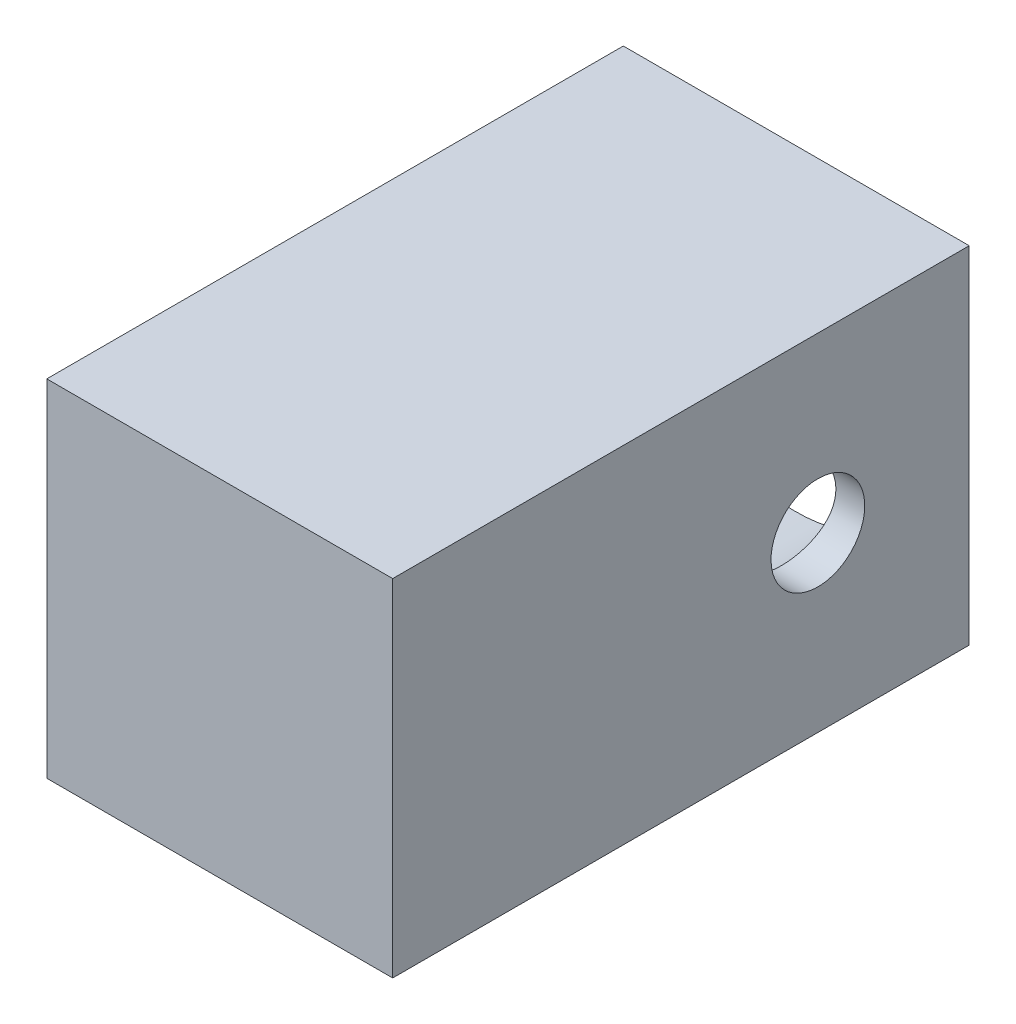
ISO-10303-21;
HEADER;
FILE_DESCRIPTION(('STEP AP214'),'2;1');
FILE_NAME('part.step','',(''),(''),'','','');
FILE_SCHEMA(('AUTOMOTIVE_DESIGN { 1 0 10303 214 1 1 1 1 }'));
ENDSEC;
DATA;
#1=APPLICATION_CONTEXT('core data for automotive mechanical design processes');
#2=APPLICATION_PROTOCOL_DEFINITION('international standard','automotive_design',2000,#1);
#3=PRODUCT_CONTEXT('',#1,'mechanical');
#4=PRODUCT('Part','Part','',(#3));
#5=PRODUCT_RELATED_PRODUCT_CATEGORY('part','',(#4));
#6=PRODUCT_DEFINITION_FORMATION('','',#4);
#7=PRODUCT_DEFINITION_CONTEXT('part definition',#1,'design');
#8=PRODUCT_DEFINITION('design','',#6,#7);
#9=PRODUCT_DEFINITION_SHAPE('','',#8);
#10=(LENGTH_UNIT() NAMED_UNIT(*) SI_UNIT(.MILLI.,.METRE.));
#11=(NAMED_UNIT(*) PLANE_ANGLE_UNIT() SI_UNIT($,.RADIAN.));
#12=(NAMED_UNIT(*) SI_UNIT($,.STERADIAN.) SOLID_ANGLE_UNIT());
#13=UNCERTAINTY_MEASURE_WITH_UNIT(LENGTH_MEASURE(1.E-05),#10,'distance_accuracy_value','');
#14=(GEOMETRIC_REPRESENTATION_CONTEXT(3) GLOBAL_UNCERTAINTY_ASSIGNED_CONTEXT((#13)) GLOBAL_UNIT_ASSIGNED_CONTEXT((#10,
#11,#12)) REPRESENTATION_CONTEXT('',''));
#15=CARTESIAN_POINT('',(0.,0.,0.));
#16=DIRECTION('',(0.,0.,1.));
#17=DIRECTION('',(1.,0.,0.));
#18=AXIS2_PLACEMENT_3D('',#15,#16,#17);
#19=CARTESIAN_POINT('',(12.,12.,6.48901439578824));
#20=DIRECTION('',(1.,0.,0.));
#21=DIRECTION('',(0.,1.,0.));
#22=AXIS2_PLACEMENT_3D('',#19,#20,#21);
#23=PLANE('',#22);
#24=CARTESIAN_POINT('',(12.,0.,16.9890143957882));
#25=DIRECTION('',(1.,0.,0.));
#26=DIRECTION('',(0.,1.,0.));
#27=AXIS2_PLACEMENT_3D('',#24,#25,#26);
#28=CIRCLE('',#27,3.24999999999999);
#29=CARTESIAN_POINT('',(12.,3.25,16.9890143957882));
#30=VERTEX_POINT('',#29);
#31=EDGE_CURVE('E104',#30,#30,#28,.T.);
#32=ORIENTED_EDGE('',*,*,#31,.F.);
#33=EDGE_LOOP('',(#32));
#34=FACE_BOUND('',#33,.T.);
#35=DIRECTION('',(0.,0.,1.));
#36=VECTOR('',#35,1.);
#37=CARTESIAN_POINT('',(12.,12.,6.48901439578824));
#38=LINE('',#37,#36);
#39=CARTESIAN_POINT('',(12.,12.,6.48901439578824));
#40=VERTEX_POINT('',#39);
#41=CARTESIAN_POINT('',(12.,12.,46.4890143957882));
#42=VERTEX_POINT('',#41);
#43=EDGE_CURVE('E78',#40,#42,#38,.T.);
#44=ORIENTED_EDGE('',*,*,#43,.T.);
#45=DIRECTION('',(0.,1.,0.));
#46=VECTOR('',#45,1.);
#47=CARTESIAN_POINT('',(12.,12.,46.4890143957882));
#48=LINE('',#47,#46);
#49=CARTESIAN_POINT('',(12.,-12.,46.4890143957882));
#50=VERTEX_POINT('',#49);
#51=EDGE_CURVE('E81',#50,#42,#48,.T.);
#52=ORIENTED_EDGE('',*,*,#51,.F.);
#53=DIRECTION('',(0.,0.,1.));
#54=VECTOR('',#53,1.);
#55=CARTESIAN_POINT('',(12.,-12.,6.48901439578824));
#56=LINE('',#55,#54);
#57=CARTESIAN_POINT('',(12.,-12.,6.48901439578824));
#58=VERTEX_POINT('',#57);
#59=EDGE_CURVE('E11',#58,#50,#56,.T.);
#60=ORIENTED_EDGE('',*,*,#59,.F.);
#61=DIRECTION('',(0.,1.,0.));
#62=VECTOR('',#61,1.);
#63=CARTESIAN_POINT('',(12.,12.,6.48901439578824));
#64=LINE('',#63,#62);
#65=EDGE_CURVE('E82',#58,#40,#64,.T.);
#66=ORIENTED_EDGE('',*,*,#65,.T.);
#67=EDGE_LOOP('',(#44,#52,#60,#66));
#68=FACE_BOUND('',#67,.T.);
#69=ADVANCED_FACE('F35',(#34,#68),#23,.T.);
#70=CARTESIAN_POINT('',(-12.,-12.,6.48901439578824));
#71=DIRECTION('',(0.,-1.,0.));
#72=DIRECTION('',(0.,0.,-1.));
#73=AXIS2_PLACEMENT_3D('',#70,#71,#72);
#74=PLANE('',#73);
#75=ORIENTED_EDGE('',*,*,#59,.T.);
#76=DIRECTION('',(1.,0.,0.));
#77=VECTOR('',#76,1.);
#78=CARTESIAN_POINT('',(-12.,-12.,46.4890143957882));
#79=LINE('',#78,#77);
#80=CARTESIAN_POINT('',(-12.,-12.,46.4890143957882));
#81=VERTEX_POINT('',#80);
#82=EDGE_CURVE('E99',#81,#50,#79,.T.);
#83=ORIENTED_EDGE('',*,*,#82,.F.);
#84=DIRECTION('',(0.,0.,1.));
#85=VECTOR('',#84,1.);
#86=CARTESIAN_POINT('',(-12.,-12.,6.48901439578824));
#87=LINE('',#86,#85);
#88=CARTESIAN_POINT('',(-12.,-12.,6.48901439578824));
#89=VERTEX_POINT('',#88);
#90=EDGE_CURVE('E48',#89,#81,#87,.T.);
#91=ORIENTED_EDGE('',*,*,#90,.F.);
#92=DIRECTION('',(1.,0.,0.));
#93=VECTOR('',#92,1.);
#94=CARTESIAN_POINT('',(-12.,-12.,6.48901439578824));
#95=LINE('',#94,#93);
#96=EDGE_CURVE('E87',#89,#58,#95,.T.);
#97=ORIENTED_EDGE('',*,*,#96,.T.);
#98=EDGE_LOOP('',(#75,#83,#91,#97));
#99=FACE_BOUND('',#98,.T.);
#100=ADVANCED_FACE('F148',(#99),#74,.T.);
#101=CARTESIAN_POINT('',(-12.,12.,6.48901439578824));
#102=DIRECTION('',(-1.,0.,0.));
#103=DIRECTION('',(0.,-1.,0.));
#104=AXIS2_PLACEMENT_3D('',#101,#102,#103);
#105=PLANE('',#104);
#106=CARTESIAN_POINT('',(-12.,0.,16.9890143957882));
#107=DIRECTION('',(1.,0.,0.));
#108=DIRECTION('',(0.,1.,0.));
#109=AXIS2_PLACEMENT_3D('',#106,#107,#108);
#110=CIRCLE('',#109,3.24999999999999);
#111=CARTESIAN_POINT('',(-12.,3.24999999999999,16.9890143957882));
#112=VERTEX_POINT('',#111);
#113=EDGE_CURVE('E126',#112,#112,#110,.T.);
#114=ORIENTED_EDGE('',*,*,#113,.T.);
#115=EDGE_LOOP('',(#114));
#116=FACE_BOUND('',#115,.T.);
#117=ORIENTED_EDGE('',*,*,#90,.T.);
#118=DIRECTION('',(0.,-1.,0.));
#119=VECTOR('',#118,1.);
#120=CARTESIAN_POINT('',(-12.,12.,46.4890143957882));
#121=LINE('',#120,#119);
#122=CARTESIAN_POINT('',(-12.,12.,46.4890143957882));
#123=VERTEX_POINT('',#122);
#124=EDGE_CURVE('E95',#123,#81,#121,.T.);
#125=ORIENTED_EDGE('',*,*,#124,.F.);
#126=DIRECTION('',(0.,0.,1.));
#127=VECTOR('',#126,1.);
#128=CARTESIAN_POINT('',(-12.,12.,6.48901439578824));
#129=LINE('',#128,#127);
#130=CARTESIAN_POINT('',(-12.,12.,6.48901439578824));
#131=VERTEX_POINT('',#130);
#132=EDGE_CURVE('E86',#131,#123,#129,.T.);
#133=ORIENTED_EDGE('',*,*,#132,.F.);
#134=DIRECTION('',(0.,-1.,0.));
#135=VECTOR('',#134,1.);
#136=CARTESIAN_POINT('',(-12.,12.,6.48901439578824));
#137=LINE('',#136,#135);
#138=EDGE_CURVE('E118',#131,#89,#137,.T.);
#139=ORIENTED_EDGE('',*,*,#138,.T.);
#140=EDGE_LOOP('',(#117,#125,#133,#139));
#141=FACE_BOUND('',#140,.T.);
#142=ADVANCED_FACE('F153',(#116,#141),#105,.T.);
#143=CARTESIAN_POINT('',(-12.,12.,6.48901439578824));
#144=DIRECTION('',(0.,1.,0.));
#145=DIRECTION('',(0.,0.,1.));
#146=AXIS2_PLACEMENT_3D('',#143,#144,#145);
#147=PLANE('',#146);
#148=ORIENTED_EDGE('',*,*,#132,.T.);
#149=DIRECTION('',(-1.,0.,0.));
#150=VECTOR('',#149,1.);
#151=CARTESIAN_POINT('',(-12.,12.,46.4890143957882));
#152=LINE('',#151,#150);
#153=EDGE_CURVE('E90',#42,#123,#152,.T.);
#154=ORIENTED_EDGE('',*,*,#153,.F.);
#155=ORIENTED_EDGE('',*,*,#43,.F.);
#156=DIRECTION('',(-1.,0.,0.));
#157=VECTOR('',#156,1.);
#158=CARTESIAN_POINT('',(-12.,12.,6.48901439578824));
#159=LINE('',#158,#157);
#160=EDGE_CURVE('E116',#40,#131,#159,.T.);
#161=ORIENTED_EDGE('',*,*,#160,.T.);
#162=EDGE_LOOP('',(#148,#154,#155,#161));
#163=FACE_BOUND('',#162,.T.);
#164=ADVANCED_FACE('F91',(#163),#147,.T.);
#165=CARTESIAN_POINT('',(0.,0.,6.48901439578824));
#166=DIRECTION('',(0.,0.,1.));
#167=DIRECTION('',(1.,0.,0.));
#168=AXIS2_PLACEMENT_3D('',#165,#166,#167);
#169=PLANE('',#168);
#170=CARTESIAN_POINT('',(0.,0.,6.48901439578824));
#171=DIRECTION('',(0.,0.,-1.));
#172=DIRECTION('',(-1.,0.,0.));
#173=AXIS2_PLACEMENT_3D('',#170,#171,#172);
#174=CIRCLE('',#173,9.99999999999998);
#175=CARTESIAN_POINT('',(-9.99999999999998,0.,6.48901439578824));
#176=VERTEX_POINT('',#175);
#177=EDGE_CURVE('E110',#176,#176,#174,.T.);
#178=ORIENTED_EDGE('',*,*,#177,.F.);
#179=EDGE_LOOP('',(#178));
#180=FACE_BOUND('',#179,.T.);
#181=ORIENTED_EDGE('',*,*,#65,.F.);
#182=ORIENTED_EDGE('',*,*,#96,.F.);
#183=ORIENTED_EDGE('',*,*,#138,.F.);
#184=ORIENTED_EDGE('',*,*,#160,.F.);
#185=EDGE_LOOP('',(#181,#182,#183,#184));
#186=FACE_BOUND('',#185,.T.);
#187=ADVANCED_FACE('F145',(#180,#186),#169,.F.);
#188=CARTESIAN_POINT('',(0.,0.,26.4900143957882));
#189=DIRECTION('',(0.,0.,-1.));
#190=DIRECTION('',(-1.,0.,0.));
#191=AXIS2_PLACEMENT_3D('',#188,#189,#190);
#192=CYLINDRICAL_SURFACE('',#191,9.99999999999998);
#193=CARTESIAN_POINT('',(-9.99999999999998,0.,20.2390143957882));
#194=CARTESIAN_POINT('',(-9.99999989374563,0.177579382949033,20.2390143746817));
#195=CARTESIAN_POINT('',(-9.99522579386105,0.355160799428108,20.2244124323166));
#196=CARTESIAN_POINT('',(-9.97665017824225,0.705108112257458,20.1665587290597));
#197=CARTESIAN_POINT('',(-9.96284727999526,0.877473205641293,20.1233025805495));
#198=CARTESIAN_POINT('',(-9.9277171600686,1.21189182680223,20.0097691686129));
#199=CARTESIAN_POINT('',(-9.90640214525767,1.37396158278685,19.9395357255961));
#200=CARTESIAN_POINT('',(-9.85843361438869,1.684022624021,19.7742347440044));
#201=CARTESIAN_POINT('',(-9.83177912896554,1.83201134569423,19.6791626950993));
#202=CARTESIAN_POINT('',(-9.77495932247794,2.11461081148198,19.4635733344958));
#203=CARTESIAN_POINT('',(-9.74471295358526,2.24869037174636,19.3423812019918));
#204=CARTESIAN_POINT('',(-9.68457368482558,2.49502344091045,19.0794274297009));
#205=CARTESIAN_POINT('',(-9.65468085893922,2.60727245498119,18.9376615643285));
#206=CARTESIAN_POINT('',(-9.59775056049013,2.80972801137823,18.6328773690373));
#207=CARTESIAN_POINT('',(-9.57081237727233,2.89925504445896,18.4693873459898));
#208=CARTESIAN_POINT('',(-9.52406830823474,3.04931887139799,18.1286544955801));
#209=CARTESIAN_POINT('',(-9.50426036852435,3.10986401524674,17.9514156465226));
#210=CARTESIAN_POINT('',(-9.47487062348528,3.19827260971518,17.5942383992663));
#211=CARTESIAN_POINT('',(-9.46497952226556,3.22712741042679,17.4145715661448));
#212=CARTESIAN_POINT('',(-9.45562707493592,3.25443459132067,17.052695438782));
#213=CARTESIAN_POINT('',(-9.45616269242513,3.25289582251765,16.8704869001646));
#214=CARTESIAN_POINT('',(-9.46733131423126,3.22023155138036,16.5170493174301));
#215=CARTESIAN_POINT('',(-9.47752750417872,3.19038591816138,16.345685820052));
#216=CARTESIAN_POINT('',(-9.50615574812353,3.10403782395806,16.0105446619705));
#217=CARTESIAN_POINT('',(-9.52458874278652,3.04753231830216,15.8467678700479));
#218=CARTESIAN_POINT('',(-9.56793440052131,2.90860404188739,15.5284841210194));
#219=CARTESIAN_POINT('',(-9.59294312913817,2.82579288678076,15.3741603375314));
#220=CARTESIAN_POINT('',(-9.64658062480911,2.6368736518591,15.0811884661153));
#221=CARTESIAN_POINT('',(-9.67521039451248,2.53075911343127,14.9425447401399));
#222=CARTESIAN_POINT('',(-9.7345964473776,2.29204406554378,14.6776585904587));
#223=CARTESIAN_POINT('',(-9.76538786414673,2.15839298888211,14.5523689565385));
#224=CARTESIAN_POINT('',(-9.82438470108504,1.87159594889806,14.3257393296213));
#225=CARTESIAN_POINT('',(-9.85258989700934,1.71844829781996,14.2244014122194));
#226=CARTESIAN_POINT('',(-9.90357541398689,1.3950599629623,14.0478348154257));
#227=CARTESIAN_POINT('',(-9.92630448856866,1.22467751353946,13.9728499771897));
#228=CARTESIAN_POINT('',(-9.96340575158465,0.872803501369054,13.8528968466896));
#229=CARTESIAN_POINT('',(-9.9777806934397,0.691315620659406,13.8079186638719));
#230=CARTESIAN_POINT('',(-9.99610319938066,0.33045729567771,13.7509170853743));
#231=CARTESIAN_POINT('',(-10.0004581918424,0.151310774152581,13.7376052719299));
#232=CARTESIAN_POINT('',(-9.99946515119831,-0.206684753642987,13.7406593911605));
#233=CARTESIAN_POINT('',(-9.99411866512872,-0.385533802797547,13.7570205920586));
#234=CARTESIAN_POINT('',(-9.97459190888945,-0.732777014929082,13.8179305212018));
#235=CARTESIAN_POINT('',(-9.96065655544009,-0.901323284372865,13.8616982699064));
#236=CARTESIAN_POINT('',(-9.92560343144513,-1.22862125569252,13.9752120356593));
#237=CARTESIAN_POINT('',(-9.9044847549493,-1.38737171915065,14.0449613295678));
#238=CARTESIAN_POINT('',(-9.85654869030634,-1.69509055480488,14.2104416660227));
#239=CARTESIAN_POINT('',(-9.829599442936,-1.84370519348154,14.3067912206631));
#240=CARTESIAN_POINT('',(-9.77306882676682,-2.12308150730874,14.5220042997615));
#241=CARTESIAN_POINT('',(-9.74348669127604,-2.25383795390917,14.6408743936052));
#242=CARTESIAN_POINT('',(-9.68341394517993,-2.49964097258611,14.9038153738324));
#243=CARTESIAN_POINT('',(-9.65293908057765,-2.61376838975716,15.0487511370257));
#244=CARTESIAN_POINT('',(-9.5958434922003,-2.81618275812032,15.3563753984434));
#245=CARTESIAN_POINT('',(-9.56922275883546,-2.90446977360853,15.5190638524943));
#246=CARTESIAN_POINT('',(-9.52312626728822,-3.05222465357593,15.8574669351836));
#247=CARTESIAN_POINT('',(-9.50363019104652,-3.11177462835521,16.0331427762512));
#248=CARTESIAN_POINT('',(-9.47422438151484,-3.20020095668875,16.3928021773607));
#249=CARTESIAN_POINT('',(-9.46431060836478,-3.22909023717127,16.5767822021199));
#250=CARTESIAN_POINT('',(-9.45563586870715,-3.25439854839941,16.9381545132312));
#251=CARTESIAN_POINT('',(-9.45635339998914,-3.25233581624123,17.1154291888856));
#252=CARTESIAN_POINT('',(-9.46758016662912,-3.21950614466644,17.466968391955));
#253=CARTESIAN_POINT('',(-9.47808887260451,-3.18874075712543,17.641233081593));
#254=CARTESIAN_POINT('',(-9.50733511912919,-3.10043070730133,17.9788465015164));
#255=CARTESIAN_POINT('',(-9.52592844913923,-3.04335434275121,18.1423311825667));
#256=CARTESIAN_POINT('',(-9.56920216910217,-2.90441722996808,18.4575315712368));
#257=CARTESIAN_POINT('',(-9.59388386623477,-2.82255115849536,18.609244742292));
#258=CARTESIAN_POINT('',(-9.64784088636395,-2.63235879697991,18.9034705792516));
#259=CARTESIAN_POINT('',(-9.67726517521802,-2.52306891129123,19.0453329171629));
#260=CARTESIAN_POINT('',(-9.73674387050345,-2.28278717900075,19.3091953027714));
#261=CARTESIAN_POINT('',(-9.76679844907539,-2.15178933442872,19.4311898424167));
#262=CARTESIAN_POINT('',(-9.82546252093757,-1.86608754817447,19.6563111940064));
#263=CARTESIAN_POINT('',(-9.8539797754208,-1.71069498742675,19.758590983931));
#264=CARTESIAN_POINT('',(-9.90514098282106,-1.38400159009725,19.9354550494655));
#265=CARTESIAN_POINT('',(-9.92778677175247,-1.21270574929995,20.0100479859444));
#266=CARTESIAN_POINT('',(-9.96349655118999,-0.869832380696065,20.1253474317787));
#267=CARTESIAN_POINT('',(-9.977060307551,-0.698908003473848,20.1678417849887));
#268=CARTESIAN_POINT('',(-9.99531100077968,-0.351988917437687,20.2246718393607));
#269=CARTESIAN_POINT('',(-10.0000001053066,-0.175995457426614,20.2390144167065));
#270=CARTESIAN_POINT('',(-9.99999999999998,0.,20.2390143957882));
#271=B_SPLINE_CURVE_WITH_KNOTS('',3,(#193,#194,#195,#196,#197,#198,#199,#200,#201,#202,#203,
#204,#205,#206,#207,#208,#209,#210,#211,#212,#213,#214,#215,#216,#217,#218,#219,#220,#221,#222,
#223,#224,#225,#226,#227,#228,#229,#230,#231,#232,#233,#234,#235,#236,#237,#238,#239,#240,#241,
#242,#243,#244,#245,#246,#247,#248,#249,#250,#251,#252,#253,#254,#255,#256,#257,#258,#259,#260,
#261,#262,#263,#264,#265,#266,#267,#268,#269,#270),.UNSPECIFIED.,.T.,.F.,(4,2,2,2,2,2,2,2,2,2,2,
2,2,2,2,2,2,2,2,2,2,2,2,2,2,2,2,2,2,2,2,2,2,2,2,2,2,2,4),(0.,0.532090801254676,1.06426309669592,
1.59557459199055,2.1269826328768,2.67425296309552,3.22163585524026,3.78384740278183,
4.34589687356044,4.88981368187708,5.43357209666656,5.95386117923411,6.47420969543026,
7.00262882865678,7.53119460031026,8.08590846442152,8.64067038102184,9.20043805582588,
9.76002113320906,10.2964148728263,10.8327230844865,11.3544036147969,11.8761499631049,
12.4112318399366,12.9464700445872,13.5047604456697,14.0630494576023,14.6197336846483,
15.176183113382,15.7054311330744,16.2346505394039,16.7547941299287,17.2750494932519,
17.8170673976498,18.3592353135956,18.9211107593865,19.4828102935623,20.0102839458811,
20.537628744608),.UNSPECIFIED.);
#272=CARTESIAN_POINT('',(-9.99999999999998,0.,20.2390143957882));
#273=VERTEX_POINT('',#272);
#274=EDGE_CURVE('E38',#273,#273,#271,.T.);
#275=ORIENTED_EDGE('',*,*,#274,.T.);
#276=EDGE_LOOP('',(#275));
#277=FACE_BOUND('',#276,.T.);
#278=CARTESIAN_POINT('',(9.45714015968884,3.25,16.9890143957882));
#279=CARTESIAN_POINT('',(9.45714031975423,3.2499999659442,17.1663139267721));
#280=CARTESIAN_POINT('',(9.46218061553843,3.23544233910946,17.3436154748467));
#281=CARTESIAN_POINT('',(9.48169889974064,3.17778063387205,17.6929836282262));
#282=CARTESIAN_POINT('',(9.49617883832325,3.13467065672283,17.8650491441134));
#283=CARTESIAN_POINT('',(9.53276684736508,3.0215640876378,18.1988305137538));
#284=CARTESIAN_POINT('',(9.55486055631603,2.95161808731896,18.3605651781279));
#285=CARTESIAN_POINT('',(9.6041661968066,2.78699619388974,18.6700536839378));
#286=CARTESIAN_POINT('',(9.63137916829213,2.69231527451471,18.8178046754958));
#287=CARTESIAN_POINT('',(9.68899176574423,2.47714104411863,19.1006245979286));
#288=CARTESIAN_POINT('',(9.71946792284958,2.35588471696472,19.2350975668969));
#289=CARTESIAN_POINT('',(9.7795243688465,2.09263184494554,19.4822033629128));
#290=CARTESIAN_POINT('',(9.80910452115727,1.95063215712304,19.5948328742905));
#291=CARTESIAN_POINT('',(9.86491782280743,1.64559602796293,19.7977284017316));
#292=CARTESIAN_POINT('',(9.89105042825691,1.4821271180699,19.8873743339287));
#293=CARTESIAN_POINT('',(9.93612574183377,1.14143632793768,20.0376633576671));
#294=CARTESIAN_POINT('',(9.95507028595166,0.964217973560287,20.0983138563166));
#295=CARTESIAN_POINT('',(9.98309301263067,0.607303975463926,20.1868820748455));
#296=CARTESIAN_POINT('',(9.9924779086066,0.427885967277274,20.2158197770988));
#297=CARTESIAN_POINT('',(10.0014104232845,0.066512037622942,20.2433794814148));
#298=CARTESIAN_POINT('',(10.0009604553388,-0.115443250276197,20.2420089207445));
#299=CARTESIAN_POINT('',(9.99048411795753,-0.469523771450075,20.2096477530111));
#300=CARTESIAN_POINT('',(9.98081565195019,-0.641762482940364,20.1797641205835));
#301=CARTESIAN_POINT('',(9.95343429447755,-0.978632246401618,20.0930498875213));
#302=CARTESIAN_POINT('',(9.93572086532965,-1.14326278907262,20.0362174857631));
#303=CARTESIAN_POINT('',(9.89377411201856,-1.46271759756165,19.8965465095887));
#304=CARTESIAN_POINT('',(9.86946026188098,-1.61738943124247,19.8133844748852));
#305=CARTESIAN_POINT('',(9.81685615924597,-1.91091693128665,19.6236785006658));
#306=CARTESIAN_POINT('',(9.78856484119445,-2.04976834129095,19.5171282912065));
#307=CARTESIAN_POINT('',(9.72950106071723,-2.31430549384568,19.2780490684562));
#308=CARTESIAN_POINT('',(9.69867422994169,-2.4391204093666,19.1445685650723));
#309=CARTESIAN_POINT('',(9.63909486372541,-2.66486690355386,18.8582973052689));
#310=CARTESIAN_POINT('',(9.61034261635579,-2.76579516980327,18.7055038751827));
#311=CARTESIAN_POINT('',(9.55787955588511,-2.94202938013298,18.3823069232977));
#312=CARTESIAN_POINT('',(9.534238909211,-3.01698630603796,18.2117008377492));
#313=CARTESIAN_POINT('',(9.49549194347804,-3.13682094119597,17.859329718701));
#314=CARTESIAN_POINT('',(9.4803822583074,-3.18171051560575,17.6775691179348));
#315=CARTESIAN_POINT('',(9.46116378995734,-3.23840120551585,17.3164468563096));
#316=CARTESIAN_POINT('',(9.45660869381156,-3.25154577533659,17.1373197726561));
#317=CARTESIAN_POINT('',(9.45777099529461,-3.24816506242596,16.7793980940584));
#318=CARTESIAN_POINT('',(9.46348664335146,-3.23164483295111,16.6006034476787));
#319=CARTESIAN_POINT('',(9.4841032075596,-3.17060807190336,16.25439849545));
#320=CARTESIAN_POINT('',(9.49870345169871,-3.1270070478687,16.0868069834327));
#321=CARTESIAN_POINT('',(9.53511831835133,-3.0141352607906,15.7613459551098));
#322=CARTESIAN_POINT('',(9.5569341791546,-2.94486009149767,15.6034781130273));
#323=CARTESIAN_POINT('',(9.60614721606394,-2.78020029035674,15.2966112301551));
#324=CARTESIAN_POINT('',(9.63369436385386,-2.68408357895598,15.148029700064));
#325=CARTESIAN_POINT('',(9.69096725740344,-2.46930881957964,14.8686171614482));
#326=CARTESIAN_POINT('',(9.72069361317378,-2.35064444508002,14.7377911525504));
#327=CARTESIAN_POINT('',(9.78060713966298,-2.087745080266,14.4914734616667));
#328=CARTESIAN_POINT('',(9.81075403007329,-1.94259422975941,14.3769467666538));
#329=CARTESIAN_POINT('',(9.86677456184761,-1.63439731618794,14.1738238330648));
#330=CARTESIAN_POINT('',(9.89264837523294,-1.47135197394191,14.0852265505369));
#331=CARTESIAN_POINT('',(9.93707445650377,-1.13289346303608,13.9373083442409));
#332=CARTESIAN_POINT('',(9.95567674524015,-0.957574938068058,13.8777866747499));
#333=CARTESIAN_POINT('',(9.98368172068447,-0.598697534609188,13.7892979712038));
#334=CARTESIAN_POINT('',(9.99308754661656,-0.415141490398969,13.7603205105806));
#335=CARTESIAN_POINT('',(10.00141457445,-0.0538483383324457,13.7346444697407));
#336=CARTESIAN_POINT('',(10.0007868427667,0.12378079647269,13.7365572369204));
#337=CARTESIAN_POINT('',(9.990215608696,0.476070007471439,13.7692092752229));
#338=CARTESIAN_POINT('',(9.98027280013972,0.650730303811704,13.7999463993711));
#339=CARTESIAN_POINT('',(9.95234501872027,0.98962088757608,13.8884676140498));
#340=CARTESIAN_POINT('',(9.93447846708204,1.15396550686853,13.9458540022602));
#341=CARTESIAN_POINT('',(9.89254335033117,1.47076416800393,14.0856805162948));
#342=CARTESIAN_POINT('',(9.86847368418029,1.62321609265707,14.1681250903546));
#343=CARTESIAN_POINT('',(9.81555378161619,1.91784189154064,14.3591288483792));
#344=CARTESIAN_POINT('',(9.78656335044509,2.05945312297857,14.4685166033993));
#345=CARTESIAN_POINT('',(9.7274355462714,2.32276630111765,14.7088713009165));
#346=CARTESIAN_POINT('',(9.69729781882269,2.44446203257074,14.8398449544635));
#347=CARTESIAN_POINT('',(9.63796513947996,2.66901287727712,15.1254022067636));
#348=CARTESIAN_POINT('',(9.60884528614322,2.77101345238615,15.2806754683197));
#349=CARTESIAN_POINT('',(9.55622558839877,2.94738303474979,15.6070553389293));
#350=CARTESIAN_POINT('',(9.53272393962412,3.02176091768745,15.7781568399649));
#351=CARTESIAN_POINT('',(9.49550334814006,3.13669494452505,16.1205564798929));
#352=CARTESIAN_POINT('',(9.48127131053793,3.17905105398647,16.2911943049924));
#353=CARTESIAN_POINT('',(9.46209103822371,3.23569936279265,16.6375599266701));
#354=CARTESIAN_POINT('',(9.45714000104203,3.25000003375398,16.813286170481));
#355=CARTESIAN_POINT('',(9.45714015968884,3.25,16.9890143957882));
#356=B_SPLINE_CURVE_WITH_KNOTS('',3,(#278,#279,#280,#281,#282,#283,#284,#285,#286,#287,#288,
#289,#290,#291,#292,#293,#294,#295,#296,#297,#298,#299,#300,#301,#302,#303,#304,#305,#306,#307,
#308,#309,#310,#311,#312,#313,#314,#315,#316,#317,#318,#319,#320,#321,#322,#323,#324,#325,#326,
#327,#328,#329,#330,#331,#332,#333,#334,#335,#336,#337,#338,#339,#340,#341,#342,#343,#344,#345,
#346,#347,#348,#349,#350,#351,#352,#353,#354,#355),.UNSPECIFIED.,.T.,.F.,(4,2,2,2,2,2,2,2,2,2,2,
2,2,2,2,2,2,2,2,2,2,2,2,2,2,2,2,2,2,2,2,2,2,2,2,2,2,2,4),(0.,0.53124850503718,1.06260679711987,
1.59296824911441,2.12343755726666,2.67180188546717,3.22024938614484,3.78222372984979,
4.34405443604297,4.88723029743206,5.43027287176744,5.9530555720968,6.47587321758632,
7.00538064397245,7.53503019539511,8.08845610905498,8.64195872265873,9.20263474595128,
9.76308938511446,10.2993744444867,10.8355681589328,11.3545536787972,11.8736283092985,
12.4085390846315,12.9436001698433,13.5029364155139,14.0622501384862,14.6176456234263,
15.1728514571604,15.7031706450782,16.2334503354496,16.7560588347682,17.278760159833,
17.8201569265527,18.3617223320029,18.9231471315414,19.4843913784856,20.0110907944363,
20.5376311438055),.UNSPECIFIED.);
#357=CARTESIAN_POINT('',(9.45714015968884,3.25,16.9890143957882));
#358=VERTEX_POINT('',#357);
#359=EDGE_CURVE('E102',#358,#358,#356,.T.);
#360=ORIENTED_EDGE('',*,*,#359,.T.);
#361=EDGE_LOOP('',(#360));
#362=FACE_BOUND('',#361,.T.);
#363=CARTESIAN_POINT('',(0.,0.,26.4890143957882));
#364=DIRECTION('',(0.,0.,1.));
#365=DIRECTION('',(1.,0.,0.));
#366=AXIS2_PLACEMENT_3D('',#363,#364,#365);
#367=CIRCLE('',#366,9.99999999999998);
#368=CARTESIAN_POINT('',(9.99999999999998,0.,26.4890143957882));
#369=VERTEX_POINT('',#368);
#370=EDGE_CURVE('E109',#369,#369,#367,.F.);
#371=ORIENTED_EDGE('',*,*,#370,.F.);
#372=EDGE_LOOP('',(#371));
#373=FACE_BOUND('',#372,.T.);
#374=ORIENTED_EDGE('',*,*,#177,.T.);
#375=EDGE_LOOP('',(#374));
#376=FACE_BOUND('',#375,.T.);
#377=ADVANCED_FACE('F127',(#277,#362,#373,#376),#192,.F.);
#378=CARTESIAN_POINT('',(0.,0.,26.4890143957882));
#379=DIRECTION('',(0.,0.,1.));
#380=DIRECTION('',(1.,0.,0.));
#381=AXIS2_PLACEMENT_3D('',#378,#379,#380);
#382=PLANE('',#381);
#383=ORIENTED_EDGE('',*,*,#370,.T.);
#384=EDGE_LOOP('',(#383));
#385=FACE_BOUND('',#384,.T.);
#386=ADVANCED_FACE('F139',(#385),#382,.F.);
#387=CARTESIAN_POINT('',(0.,0.,46.4890143957882));
#388=DIRECTION('',(0.,0.,1.));
#389=DIRECTION('',(1.,0.,0.));
#390=AXIS2_PLACEMENT_3D('',#387,#388,#389);
#391=PLANE('',#390);
#392=ORIENTED_EDGE('',*,*,#51,.T.);
#393=ORIENTED_EDGE('',*,*,#153,.T.);
#394=ORIENTED_EDGE('',*,*,#124,.T.);
#395=ORIENTED_EDGE('',*,*,#82,.T.);
#396=EDGE_LOOP('',(#392,#393,#394,#395));
#397=FACE_BOUND('',#396,.T.);
#398=ADVANCED_FACE('F98',(#397),#391,.T.);
#399=CARTESIAN_POINT('',(-12.,0.,16.9890143957882));
#400=DIRECTION('',(1.,0.,0.));
#401=DIRECTION('',(0.,1.,0.));
#402=AXIS2_PLACEMENT_3D('',#399,#400,#401);
#403=CYLINDRICAL_SURFACE('',#402,3.24999999999999);
#404=ORIENTED_EDGE('',*,*,#31,.T.);
#405=EDGE_LOOP('',(#404));
#406=FACE_BOUND('',#405,.T.);
#407=ORIENTED_EDGE('',*,*,#359,.F.);
#408=EDGE_LOOP('',(#407));
#409=FACE_BOUND('',#408,.T.);
#410=ADVANCED_FACE('F135',(#406,#409),#403,.F.);
#411=ORIENTED_EDGE('',*,*,#113,.F.);
#412=EDGE_LOOP('',(#411));
#413=FACE_BOUND('',#412,.T.);
#414=ORIENTED_EDGE('',*,*,#274,.F.);
#415=EDGE_LOOP('',(#414));
#416=FACE_BOUND('',#415,.T.);
#417=ADVANCED_FACE('F131',(#413,#416),#403,.F.);
#418=CLOSED_SHELL('',(#69,#100,#142,#164,#187,#377,#386,#398,#410,#417));
#419=MANIFOLD_SOLID_BREP('B2',#418);
#420=ADVANCED_BREP_SHAPE_REPRESENTATION('',(#18,#419),#14);
#421=SHAPE_DEFINITION_REPRESENTATION(#9,#420);
ENDSEC;
END-ISO-10303-21;
